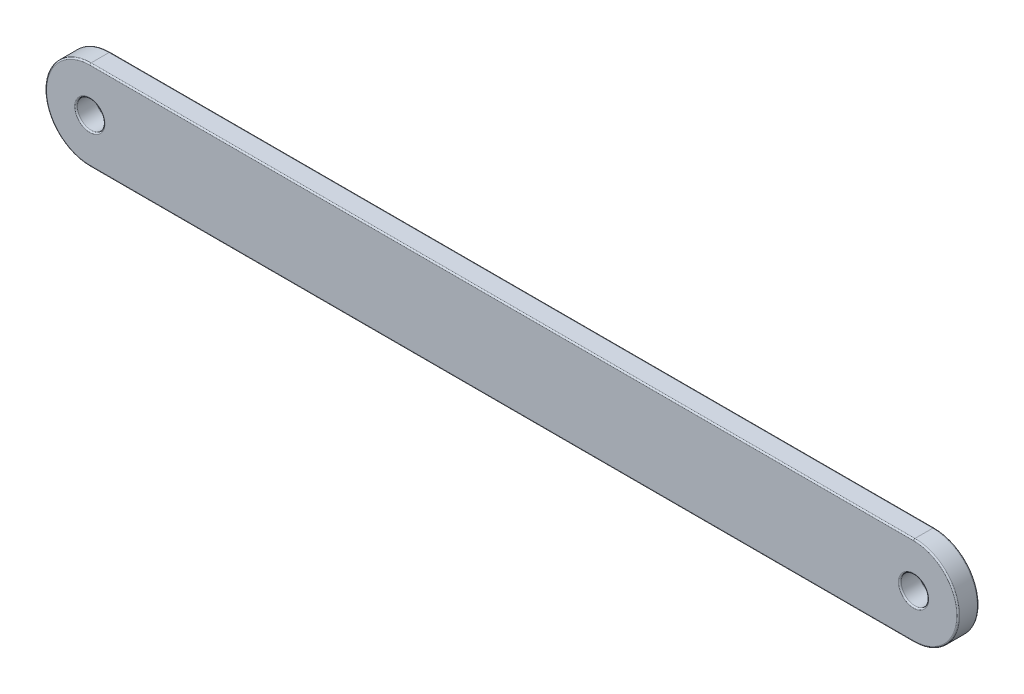
ISO-10303-21;
HEADER;
FILE_DESCRIPTION(('STEP AP214'),'2;1');
FILE_NAME('part.step','',(''),(''),'','','');
FILE_SCHEMA(('AUTOMOTIVE_DESIGN { 1 0 10303 214 1 1 1 1 }'));
ENDSEC;
DATA;
#1=APPLICATION_CONTEXT('core data for automotive mechanical design processes');
#2=APPLICATION_PROTOCOL_DEFINITION('international standard','automotive_design',2000,#1);
#3=PRODUCT_CONTEXT('',#1,'mechanical');
#4=PRODUCT('Part','Part','',(#3));
#5=PRODUCT_RELATED_PRODUCT_CATEGORY('part','',(#4));
#6=PRODUCT_DEFINITION_FORMATION('','',#4);
#7=PRODUCT_DEFINITION_CONTEXT('part definition',#1,'design');
#8=PRODUCT_DEFINITION('design','',#6,#7);
#9=PRODUCT_DEFINITION_SHAPE('','',#8);
#10=(LENGTH_UNIT() NAMED_UNIT(*) SI_UNIT(.MILLI.,.METRE.));
#11=(NAMED_UNIT(*) PLANE_ANGLE_UNIT() SI_UNIT($,.RADIAN.));
#12=(NAMED_UNIT(*) SI_UNIT($,.STERADIAN.) SOLID_ANGLE_UNIT());
#13=UNCERTAINTY_MEASURE_WITH_UNIT(LENGTH_MEASURE(1.E-05),#10,'distance_accuracy_value','');
#14=(GEOMETRIC_REPRESENTATION_CONTEXT(3) GLOBAL_UNCERTAINTY_ASSIGNED_CONTEXT((#13)) GLOBAL_UNIT_ASSIGNED_CONTEXT((#10,
#11,#12)) REPRESENTATION_CONTEXT('',''));
#15=CARTESIAN_POINT('',(0.,0.,0.));
#16=DIRECTION('',(0.,0.,1.));
#17=DIRECTION('',(1.,0.,0.));
#18=AXIS2_PLACEMENT_3D('',#15,#16,#17);
#19=CARTESIAN_POINT('',(-30.,0.,1.5));
#20=DIRECTION('',(0.,0.,1.));
#21=DIRECTION('',(1.,0.,0.));
#22=AXIS2_PLACEMENT_3D('',#19,#20,#21);
#23=PLANE('',#22);
#24=CARTESIAN_POINT('',(30.,0.,1.5));
#25=DIRECTION('',(0.,0.,1.));
#26=DIRECTION('',(1.,0.,0.));
#27=AXIS2_PLACEMENT_3D('',#24,#25,#26);
#28=CIRCLE('',#27,1.1);
#29=CARTESIAN_POINT('',(31.1,0.,1.5));
#30=VERTEX_POINT('',#29);
#31=EDGE_CURVE('E159',#30,#30,#28,.F.);
#32=ORIENTED_EDGE('',*,*,#31,.T.);
#33=EDGE_LOOP('',(#32));
#34=FACE_BOUND('',#33,.T.);
#35=CARTESIAN_POINT('',(-30.,0.,1.5));
#36=DIRECTION('',(0.,0.,1.));
#37=DIRECTION('',(1.,0.,0.));
#38=AXIS2_PLACEMENT_3D('',#35,#36,#37);
#39=CIRCLE('',#38,1.1);
#40=CARTESIAN_POINT('',(-28.9,0.,1.5));
#41=VERTEX_POINT('',#40);
#42=EDGE_CURVE('E156',#41,#41,#39,.F.);
#43=ORIENTED_EDGE('',*,*,#42,.T.);
#44=EDGE_LOOP('',(#43));
#45=FACE_BOUND('',#44,.T.);
#46=DIRECTION('',(-1.,0.,0.));
#47=VECTOR('',#46,1.);
#48=CARTESIAN_POINT('',(-30.,3.15,1.5));
#49=LINE('',#48,#47);
#50=CARTESIAN_POINT('',(30.,3.15000000000001,1.5));
#51=VERTEX_POINT('',#50);
#52=CARTESIAN_POINT('',(-30.,3.15,1.5));
#53=VERTEX_POINT('',#52);
#54=EDGE_CURVE('E147',#51,#53,#49,.T.);
#55=ORIENTED_EDGE('',*,*,#54,.T.);
#56=CARTESIAN_POINT('',(-30.,0.,1.5));
#57=DIRECTION('',(0.,0.,1.));
#58=DIRECTION('',(1.,0.,0.));
#59=AXIS2_PLACEMENT_3D('',#56,#57,#58);
#60=CIRCLE('',#59,3.15);
#61=CARTESIAN_POINT('',(-30.,-3.15,1.5));
#62=VERTEX_POINT('',#61);
#63=EDGE_CURVE('E153',#53,#62,#60,.T.);
#64=ORIENTED_EDGE('',*,*,#63,.T.);
#65=DIRECTION('',(1.,0.,0.));
#66=VECTOR('',#65,1.);
#67=CARTESIAN_POINT('',(30.,-3.14999999999999,1.5));
#68=LINE('',#67,#66);
#69=CARTESIAN_POINT('',(30.,-3.14999999999999,1.5));
#70=VERTEX_POINT('',#69);
#71=EDGE_CURVE('E151',#62,#70,#68,.T.);
#72=ORIENTED_EDGE('',*,*,#71,.T.);
#73=CARTESIAN_POINT('',(30.,0.,1.5));
#74=DIRECTION('',(0.,0.,1.));
#75=DIRECTION('',(1.,0.,0.));
#76=AXIS2_PLACEMENT_3D('',#73,#74,#75);
#77=CIRCLE('',#76,3.15);
#78=EDGE_CURVE('E149',#70,#51,#77,.T.);
#79=ORIENTED_EDGE('',*,*,#78,.T.);
#80=EDGE_LOOP('',(#55,#64,#72,#79));
#81=FACE_BOUND('',#80,.T.);
#82=ADVANCED_FACE('F37',(#34,#45,#81),#23,.T.);
#83=CARTESIAN_POINT('',(-30.,0.,0.));
#84=DIRECTION('',(0.,0.,1.));
#85=DIRECTION('',(1.,0.,0.));
#86=AXIS2_PLACEMENT_3D('',#83,#84,#85);
#87=PLANE('',#86);
#88=CARTESIAN_POINT('',(30.,0.,0.));
#89=DIRECTION('',(0.,0.,1.));
#90=DIRECTION('',(1.,0.,0.));
#91=AXIS2_PLACEMENT_3D('',#88,#89,#90);
#92=CIRCLE('',#91,1.1);
#93=CARTESIAN_POINT('',(31.1,0.,0.));
#94=VERTEX_POINT('',#93);
#95=EDGE_CURVE('E134',#94,#94,#92,.T.);
#96=ORIENTED_EDGE('',*,*,#95,.T.);
#97=EDGE_LOOP('',(#96));
#98=FACE_BOUND('',#97,.T.);
#99=CARTESIAN_POINT('',(-30.,0.,0.));
#100=DIRECTION('',(0.,0.,1.));
#101=DIRECTION('',(1.,0.,0.));
#102=AXIS2_PLACEMENT_3D('',#99,#100,#101);
#103=CIRCLE('',#102,1.1);
#104=CARTESIAN_POINT('',(-28.9,0.,0.));
#105=VERTEX_POINT('',#104);
#106=EDGE_CURVE('E131',#105,#105,#103,.T.);
#107=ORIENTED_EDGE('',*,*,#106,.T.);
#108=EDGE_LOOP('',(#107));
#109=FACE_BOUND('',#108,.T.);
#110=DIRECTION('',(1.,0.,0.));
#111=VECTOR('',#110,1.);
#112=CARTESIAN_POINT('',(-30.,-3.15,0.));
#113=LINE('',#112,#111);
#114=CARTESIAN_POINT('',(30.,-3.14999999999999,0.));
#115=VERTEX_POINT('',#114);
#116=CARTESIAN_POINT('',(-30.,-3.15,0.));
#117=VERTEX_POINT('',#116);
#118=EDGE_CURVE('E130',#115,#117,#113,.F.);
#119=ORIENTED_EDGE('',*,*,#118,.T.);
#120=CARTESIAN_POINT('',(-30.,0.,0.));
#121=DIRECTION('',(0.,0.,1.));
#122=DIRECTION('',(1.,0.,0.));
#123=AXIS2_PLACEMENT_3D('',#120,#121,#122);
#124=CIRCLE('',#123,3.15);
#125=CARTESIAN_POINT('',(-30.,3.15,0.));
#126=VERTEX_POINT('',#125);
#127=EDGE_CURVE('E109',#117,#126,#124,.F.);
#128=ORIENTED_EDGE('',*,*,#127,.T.);
#129=DIRECTION('',(-1.,0.,0.));
#130=VECTOR('',#129,1.);
#131=CARTESIAN_POINT('',(-30.,3.15,0.));
#132=LINE('',#131,#130);
#133=CARTESIAN_POINT('',(30.,3.15000000000001,0.));
#134=VERTEX_POINT('',#133);
#135=EDGE_CURVE('E119',#126,#134,#132,.F.);
#136=ORIENTED_EDGE('',*,*,#135,.T.);
#137=CARTESIAN_POINT('',(30.,0.,0.));
#138=DIRECTION('',(0.,0.,1.));
#139=DIRECTION('',(1.,0.,0.));
#140=AXIS2_PLACEMENT_3D('',#137,#138,#139);
#141=CIRCLE('',#140,3.15);
#142=EDGE_CURVE('E125',#134,#115,#141,.F.);
#143=ORIENTED_EDGE('',*,*,#142,.T.);
#144=EDGE_LOOP('',(#119,#128,#136,#143));
#145=FACE_BOUND('',#144,.T.);
#146=ADVANCED_FACE('F128',(#98,#109,#145),#87,.F.);
#147=CARTESIAN_POINT('',(-30.,0.,1.5));
#148=DIRECTION('',(0.,0.,-1.));
#149=DIRECTION('',(-1.,0.,0.));
#150=AXIS2_PLACEMENT_3D('',#147,#148,#149);
#151=CYLINDRICAL_SURFACE('',#150,3.25);
#152=DIRECTION('',(0.,0.,-1.));
#153=VECTOR('',#152,1.);
#154=CARTESIAN_POINT('',(-30.,3.25,1.5));
#155=LINE('',#154,#153);
#156=CARTESIAN_POINT('',(-30.,3.25,1.4));
#157=VERTEX_POINT('',#156);
#158=CARTESIAN_POINT('',(-30.,3.25,0.1));
#159=VERTEX_POINT('',#158);
#160=EDGE_CURVE('E184',#157,#159,#155,.T.);
#161=ORIENTED_EDGE('',*,*,#160,.T.);
#162=CARTESIAN_POINT('',(-30.,0.,0.1));
#163=DIRECTION('',(0.,0.,1.));
#164=DIRECTION('',(1.,0.,0.));
#165=AXIS2_PLACEMENT_3D('',#162,#163,#164);
#166=CIRCLE('',#165,3.25);
#167=CARTESIAN_POINT('',(-30.,-3.25,0.1));
#168=VERTEX_POINT('',#167);
#169=EDGE_CURVE('E112',#159,#168,#166,.T.);
#170=ORIENTED_EDGE('',*,*,#169,.T.);
#171=DIRECTION('',(0.,0.,-1.));
#172=VECTOR('',#171,1.);
#173=CARTESIAN_POINT('',(-30.,-3.25,1.5));
#174=LINE('',#173,#172);
#175=CARTESIAN_POINT('',(-30.,-3.25,1.4));
#176=VERTEX_POINT('',#175);
#177=EDGE_CURVE('E126',#176,#168,#174,.T.);
#178=ORIENTED_EDGE('',*,*,#177,.F.);
#179=CARTESIAN_POINT('',(-30.,0.,1.4));
#180=DIRECTION('',(0.,0.,1.));
#181=DIRECTION('',(1.,0.,0.));
#182=AXIS2_PLACEMENT_3D('',#179,#180,#181);
#183=CIRCLE('',#182,3.25);
#184=EDGE_CURVE('E168',#176,#157,#183,.F.);
#185=ORIENTED_EDGE('',*,*,#184,.T.);
#186=EDGE_LOOP('',(#161,#170,#178,#185));
#187=FACE_BOUND('',#186,.T.);
#188=ADVANCED_FACE('F223',(#187),#151,.T.);
#189=CARTESIAN_POINT('',(-30.,-3.25,1.5));
#190=DIRECTION('',(0.,1.,0.));
#191=DIRECTION('',(-1.,0.,0.));
#192=AXIS2_PLACEMENT_3D('',#189,#190,#191);
#193=PLANE('',#192);
#194=ORIENTED_EDGE('',*,*,#177,.T.);
#195=DIRECTION('',(1.,0.,0.));
#196=VECTOR('',#195,1.);
#197=CARTESIAN_POINT('',(-30.,-3.25,0.1));
#198=LINE('',#197,#196);
#199=CARTESIAN_POINT('',(30.,-3.24999999999999,0.1));
#200=VERTEX_POINT('',#199);
#201=EDGE_CURVE('E174',#168,#200,#198,.T.);
#202=ORIENTED_EDGE('',*,*,#201,.T.);
#203=DIRECTION('',(0.,0.,-1.));
#204=VECTOR('',#203,1.);
#205=CARTESIAN_POINT('',(30.,-3.24999999999999,1.5));
#206=LINE('',#205,#204);
#207=CARTESIAN_POINT('',(30.,-3.24999999999999,1.4));
#208=VERTEX_POINT('',#207);
#209=EDGE_CURVE('E205',#208,#200,#206,.T.);
#210=ORIENTED_EDGE('',*,*,#209,.F.);
#211=DIRECTION('',(1.,0.,0.));
#212=VECTOR('',#211,1.);
#213=CARTESIAN_POINT('',(-30.,-3.25,1.4));
#214=LINE('',#213,#212);
#215=EDGE_CURVE('E172',#208,#176,#214,.F.);
#216=ORIENTED_EDGE('',*,*,#215,.T.);
#217=EDGE_LOOP('',(#194,#202,#210,#216));
#218=FACE_BOUND('',#217,.T.);
#219=ADVANCED_FACE('F209',(#218),#193,.F.);
#220=CARTESIAN_POINT('',(30.,0.,1.5));
#221=DIRECTION('',(0.,0.,-1.));
#222=DIRECTION('',(-1.,0.,0.));
#223=AXIS2_PLACEMENT_3D('',#220,#221,#222);
#224=CYLINDRICAL_SURFACE('',#223,3.25);
#225=ORIENTED_EDGE('',*,*,#209,.T.);
#226=CARTESIAN_POINT('',(30.,0.,0.1));
#227=DIRECTION('',(0.,0.,1.));
#228=DIRECTION('',(1.,0.,0.));
#229=AXIS2_PLACEMENT_3D('',#226,#227,#228);
#230=CIRCLE('',#229,3.25);
#231=CARTESIAN_POINT('',(30.,3.25000000000001,0.1));
#232=VERTEX_POINT('',#231);
#233=EDGE_CURVE('E54',#200,#232,#230,.T.);
#234=ORIENTED_EDGE('',*,*,#233,.T.);
#235=DIRECTION('',(0.,0.,-1.));
#236=VECTOR('',#235,1.);
#237=CARTESIAN_POINT('',(30.,3.25000000000001,1.5));
#238=LINE('',#237,#236);
#239=CARTESIAN_POINT('',(30.,3.25000000000001,1.4));
#240=VERTEX_POINT('',#239);
#241=EDGE_CURVE('E206',#240,#232,#238,.T.);
#242=ORIENTED_EDGE('',*,*,#241,.F.);
#243=CARTESIAN_POINT('',(30.,0.,1.4));
#244=DIRECTION('',(0.,0.,1.));
#245=DIRECTION('',(1.,0.,0.));
#246=AXIS2_PLACEMENT_3D('',#243,#244,#245);
#247=CIRCLE('',#246,3.25);
#248=EDGE_CURVE('E176',#240,#208,#247,.F.);
#249=ORIENTED_EDGE('',*,*,#248,.T.);
#250=EDGE_LOOP('',(#225,#234,#242,#249));
#251=FACE_BOUND('',#250,.T.);
#252=ADVANCED_FACE('F204',(#251),#224,.T.);
#253=CARTESIAN_POINT('',(-30.,3.25,1.5));
#254=DIRECTION('',(0.,-1.,0.));
#255=DIRECTION('',(1.,0.,0.));
#256=AXIS2_PLACEMENT_3D('',#253,#254,#255);
#257=PLANE('',#256);
#258=ORIENTED_EDGE('',*,*,#241,.T.);
#259=DIRECTION('',(-1.,0.,0.));
#260=VECTOR('',#259,1.);
#261=CARTESIAN_POINT('',(-30.,3.25,0.1));
#262=LINE('',#261,#260);
#263=EDGE_CURVE('E11',#232,#159,#262,.T.);
#264=ORIENTED_EDGE('',*,*,#263,.T.);
#265=ORIENTED_EDGE('',*,*,#160,.F.);
#266=DIRECTION('',(-1.,0.,0.));
#267=VECTOR('',#266,1.);
#268=CARTESIAN_POINT('',(30.,3.25000000000001,1.4));
#269=LINE('',#268,#267);
#270=EDGE_CURVE('E46',#157,#240,#269,.F.);
#271=ORIENTED_EDGE('',*,*,#270,.T.);
#272=EDGE_LOOP('',(#258,#264,#265,#271));
#273=FACE_BOUND('',#272,.T.);
#274=ADVANCED_FACE('F225',(#273),#257,.F.);
#275=CARTESIAN_POINT('',(-30.,0.,1.5));
#276=DIRECTION('',(0.,0.,-1.));
#277=DIRECTION('',(-1.,0.,0.));
#278=AXIS2_PLACEMENT_3D('',#275,#276,#277);
#279=CYLINDRICAL_SURFACE('',#278,1.);
#280=CARTESIAN_POINT('',(-30.,0.,0.1));
#281=DIRECTION('',(0.,0.,1.));
#282=DIRECTION('',(1.,0.,0.));
#283=AXIS2_PLACEMENT_3D('',#280,#281,#282);
#284=CIRCLE('',#283,1.);
#285=CARTESIAN_POINT('',(-29.,0.,0.1));
#286=VERTEX_POINT('',#285);
#287=EDGE_CURVE('E165',#286,#286,#284,.F.);
#288=ORIENTED_EDGE('',*,*,#287,.T.);
#289=EDGE_LOOP('',(#288));
#290=FACE_BOUND('',#289,.T.);
#291=CARTESIAN_POINT('',(-30.,0.,1.4));
#292=DIRECTION('',(0.,0.,1.));
#293=DIRECTION('',(1.,0.,0.));
#294=AXIS2_PLACEMENT_3D('',#291,#292,#293);
#295=CIRCLE('',#294,1.);
#296=CARTESIAN_POINT('',(-29.,0.,1.4));
#297=VERTEX_POINT('',#296);
#298=EDGE_CURVE('E162',#297,#297,#295,.T.);
#299=ORIENTED_EDGE('',*,*,#298,.T.);
#300=EDGE_LOOP('',(#299));
#301=FACE_BOUND('',#300,.T.);
#302=ADVANCED_FACE('F227',(#290,#301),#279,.F.);
#303=CARTESIAN_POINT('',(30.,0.,1.5));
#304=DIRECTION('',(0.,0.,-1.));
#305=DIRECTION('',(-1.,0.,0.));
#306=AXIS2_PLACEMENT_3D('',#303,#304,#305);
#307=CYLINDRICAL_SURFACE('',#306,1.);
#308=CARTESIAN_POINT('',(30.,0.,0.1));
#309=DIRECTION('',(0.,0.,1.));
#310=DIRECTION('',(1.,0.,0.));
#311=AXIS2_PLACEMENT_3D('',#308,#309,#310);
#312=CIRCLE('',#311,1.);
#313=CARTESIAN_POINT('',(31.,0.,0.1));
#314=VERTEX_POINT('',#313);
#315=EDGE_CURVE('E144',#314,#314,#312,.F.);
#316=ORIENTED_EDGE('',*,*,#315,.T.);
#317=EDGE_LOOP('',(#316));
#318=FACE_BOUND('',#317,.T.);
#319=CARTESIAN_POINT('',(30.,0.,1.4));
#320=DIRECTION('',(0.,0.,1.));
#321=DIRECTION('',(1.,0.,0.));
#322=AXIS2_PLACEMENT_3D('',#319,#320,#321);
#323=CIRCLE('',#322,1.);
#324=CARTESIAN_POINT('',(31.,0.,1.4));
#325=VERTEX_POINT('',#324);
#326=EDGE_CURVE('E141',#325,#325,#323,.T.);
#327=ORIENTED_EDGE('',*,*,#326,.T.);
#328=EDGE_LOOP('',(#327));
#329=FACE_BOUND('',#328,.T.);
#330=ADVANCED_FACE('F233',(#318,#329),#307,.F.);
#331=CARTESIAN_POINT('',(30.,0.,0.1));
#332=DIRECTION('',(0.,0.,1.));
#333=DIRECTION('',(1.,0.,0.));
#334=AXIS2_PLACEMENT_3D('',#331,#332,#333);
#335=TOROIDAL_SURFACE('',#334,1.1,0.1);
#336=ORIENTED_EDGE('',*,*,#315,.F.);
#337=EDGE_LOOP('',(#336));
#338=FACE_BOUND('',#337,.T.);
#339=ORIENTED_EDGE('',*,*,#95,.F.);
#340=EDGE_LOOP('',(#339));
#341=FACE_BOUND('',#340,.T.);
#342=ADVANCED_FACE('F248',(#338,#341),#335,.T.);
#343=CARTESIAN_POINT('',(30.,0.,1.4));
#344=DIRECTION('',(0.,0.,1.));
#345=DIRECTION('',(1.,0.,0.));
#346=AXIS2_PLACEMENT_3D('',#343,#344,#345);
#347=TOROIDAL_SURFACE('',#346,1.1,0.1);
#348=ORIENTED_EDGE('',*,*,#31,.F.);
#349=EDGE_LOOP('',(#348));
#350=FACE_BOUND('',#349,.T.);
#351=ORIENTED_EDGE('',*,*,#326,.F.);
#352=EDGE_LOOP('',(#351));
#353=FACE_BOUND('',#352,.T.);
#354=ADVANCED_FACE('F253',(#350,#353),#347,.T.);
#355=CARTESIAN_POINT('',(-30.,0.,0.1));
#356=DIRECTION('',(0.,0.,1.));
#357=DIRECTION('',(1.,0.,0.));
#358=AXIS2_PLACEMENT_3D('',#355,#356,#357);
#359=TOROIDAL_SURFACE('',#358,1.1,0.1);
#360=ORIENTED_EDGE('',*,*,#287,.F.);
#361=EDGE_LOOP('',(#360));
#362=FACE_BOUND('',#361,.T.);
#363=ORIENTED_EDGE('',*,*,#106,.F.);
#364=EDGE_LOOP('',(#363));
#365=FACE_BOUND('',#364,.T.);
#366=ADVANCED_FACE('F261',(#362,#365),#359,.T.);
#367=CARTESIAN_POINT('',(-30.,0.,1.4));
#368=DIRECTION('',(0.,0.,1.));
#369=DIRECTION('',(1.,0.,0.));
#370=AXIS2_PLACEMENT_3D('',#367,#368,#369);
#371=TOROIDAL_SURFACE('',#370,1.1,0.1);
#372=ORIENTED_EDGE('',*,*,#42,.F.);
#373=EDGE_LOOP('',(#372));
#374=FACE_BOUND('',#373,.T.);
#375=ORIENTED_EDGE('',*,*,#298,.F.);
#376=EDGE_LOOP('',(#375));
#377=FACE_BOUND('',#376,.T.);
#378=ADVANCED_FACE('F267',(#374,#377),#371,.T.);
#379=CARTESIAN_POINT('',(30.,0.,0.1));
#380=DIRECTION('',(0.,0.,1.));
#381=DIRECTION('',(1.,0.,0.));
#382=AXIS2_PLACEMENT_3D('',#379,#380,#381);
#383=TOROIDAL_SURFACE('',#382,3.15,0.1);
#384=CARTESIAN_POINT('',(30.,-3.14999999999999,0.1));
#385=DIRECTION('',(-1.,0.,0.));
#386=DIRECTION('',(0.,0.,1.));
#387=AXIS2_PLACEMENT_3D('',#384,#385,#386);
#388=CIRCLE('',#387,0.1);
#389=EDGE_CURVE('E115',#115,#200,#388,.T.);
#390=ORIENTED_EDGE('',*,*,#389,.F.);
#391=ORIENTED_EDGE('',*,*,#142,.F.);
#392=CARTESIAN_POINT('',(30.,3.15000000000001,0.1));
#393=DIRECTION('',(-1.,0.,0.));
#394=DIRECTION('',(0.,0.,1.));
#395=AXIS2_PLACEMENT_3D('',#392,#393,#394);
#396=CIRCLE('',#395,0.1);
#397=EDGE_CURVE('E122',#232,#134,#396,.T.);
#398=ORIENTED_EDGE('',*,*,#397,.F.);
#399=ORIENTED_EDGE('',*,*,#233,.F.);
#400=EDGE_LOOP('',(#390,#391,#398,#399));
#401=FACE_BOUND('',#400,.T.);
#402=ADVANCED_FACE('F218',(#401),#383,.T.);
#403=CARTESIAN_POINT('',(-30.,3.15,0.1));
#404=DIRECTION('',(-1.,0.,0.));
#405=DIRECTION('',(0.,-1.,0.));
#406=AXIS2_PLACEMENT_3D('',#403,#404,#405);
#407=CYLINDRICAL_SURFACE('',#406,0.1);
#408=ORIENTED_EDGE('',*,*,#397,.T.);
#409=ORIENTED_EDGE('',*,*,#135,.F.);
#410=CARTESIAN_POINT('',(-30.,3.15,0.1));
#411=DIRECTION('',(-1.,0.,0.));
#412=DIRECTION('',(0.,0.,1.));
#413=AXIS2_PLACEMENT_3D('',#410,#411,#412);
#414=CIRCLE('',#413,0.1);
#415=EDGE_CURVE('E105',#159,#126,#414,.T.);
#416=ORIENTED_EDGE('',*,*,#415,.F.);
#417=ORIENTED_EDGE('',*,*,#263,.F.);
#418=EDGE_LOOP('',(#408,#409,#416,#417));
#419=FACE_BOUND('',#418,.T.);
#420=ADVANCED_FACE('F120',(#419),#407,.T.);
#421=CARTESIAN_POINT('',(-30.,-3.15,0.1));
#422=DIRECTION('',(1.,0.,0.));
#423=DIRECTION('',(0.,1.,0.));
#424=AXIS2_PLACEMENT_3D('',#421,#422,#423);
#425=CYLINDRICAL_SURFACE('',#424,0.1);
#426=ORIENTED_EDGE('',*,*,#389,.T.);
#427=ORIENTED_EDGE('',*,*,#201,.F.);
#428=CARTESIAN_POINT('',(-30.,-3.15,0.1));
#429=DIRECTION('',(-1.,0.,0.));
#430=DIRECTION('',(0.,0.,1.));
#431=AXIS2_PLACEMENT_3D('',#428,#429,#430);
#432=CIRCLE('',#431,0.1);
#433=EDGE_CURVE('E116',#117,#168,#432,.T.);
#434=ORIENTED_EDGE('',*,*,#433,.F.);
#435=ORIENTED_EDGE('',*,*,#118,.F.);
#436=EDGE_LOOP('',(#426,#427,#434,#435));
#437=FACE_BOUND('',#436,.T.);
#438=ADVANCED_FACE('F220',(#437),#425,.T.);
#439=CARTESIAN_POINT('',(-30.,0.,0.1));
#440=DIRECTION('',(0.,0.,1.));
#441=DIRECTION('',(1.,0.,0.));
#442=AXIS2_PLACEMENT_3D('',#439,#440,#441);
#443=TOROIDAL_SURFACE('',#442,3.15,0.1);
#444=ORIENTED_EDGE('',*,*,#415,.T.);
#445=ORIENTED_EDGE('',*,*,#127,.F.);
#446=ORIENTED_EDGE('',*,*,#433,.T.);
#447=ORIENTED_EDGE('',*,*,#169,.F.);
#448=EDGE_LOOP('',(#444,#445,#446,#447));
#449=FACE_BOUND('',#448,.T.);
#450=ADVANCED_FACE('F107',(#449),#443,.T.);
#451=CARTESIAN_POINT('',(30.,0.,1.4));
#452=DIRECTION('',(0.,0.,1.));
#453=DIRECTION('',(1.,0.,0.));
#454=AXIS2_PLACEMENT_3D('',#451,#452,#453);
#455=TOROIDAL_SURFACE('',#454,3.15,0.1);
#456=CARTESIAN_POINT('',(30.,-3.14999999999999,1.4));
#457=DIRECTION('',(-1.,0.,0.));
#458=DIRECTION('',(0.,0.,1.));
#459=AXIS2_PLACEMENT_3D('',#456,#457,#458);
#460=CIRCLE('',#459,0.1);
#461=EDGE_CURVE('E188',#208,#70,#460,.T.);
#462=ORIENTED_EDGE('',*,*,#461,.F.);
#463=ORIENTED_EDGE('',*,*,#248,.F.);
#464=CARTESIAN_POINT('',(30.,3.15000000000001,1.4));
#465=DIRECTION('',(-1.,0.,0.));
#466=DIRECTION('',(0.,0.,1.));
#467=AXIS2_PLACEMENT_3D('',#464,#465,#466);
#468=CIRCLE('',#467,0.1);
#469=EDGE_CURVE('E41',#51,#240,#468,.T.);
#470=ORIENTED_EDGE('',*,*,#469,.F.);
#471=ORIENTED_EDGE('',*,*,#78,.F.);
#472=EDGE_LOOP('',(#462,#463,#470,#471));
#473=FACE_BOUND('',#472,.T.);
#474=ADVANCED_FACE('F39',(#473),#455,.T.);
#475=CARTESIAN_POINT('',(-30.,3.15,1.4));
#476=DIRECTION('',(1.,0.,0.));
#477=DIRECTION('',(0.,1.,0.));
#478=AXIS2_PLACEMENT_3D('',#475,#476,#477);
#479=CYLINDRICAL_SURFACE('',#478,0.1);
#480=ORIENTED_EDGE('',*,*,#469,.T.);
#481=ORIENTED_EDGE('',*,*,#270,.F.);
#482=CARTESIAN_POINT('',(-30.,3.15,1.4));
#483=DIRECTION('',(-1.,0.,0.));
#484=DIRECTION('',(0.,0.,1.));
#485=AXIS2_PLACEMENT_3D('',#482,#483,#484);
#486=CIRCLE('',#485,0.1);
#487=EDGE_CURVE('E187',#53,#157,#486,.T.);
#488=ORIENTED_EDGE('',*,*,#487,.F.);
#489=ORIENTED_EDGE('',*,*,#54,.F.);
#490=EDGE_LOOP('',(#480,#481,#488,#489));
#491=FACE_BOUND('',#490,.T.);
#492=ADVANCED_FACE('F198',(#491),#479,.T.);
#493=CARTESIAN_POINT('',(-30.,-3.15,1.4));
#494=DIRECTION('',(-1.,0.,0.));
#495=DIRECTION('',(0.,-1.,0.));
#496=AXIS2_PLACEMENT_3D('',#493,#494,#495);
#497=CYLINDRICAL_SURFACE('',#496,0.1);
#498=ORIENTED_EDGE('',*,*,#461,.T.);
#499=ORIENTED_EDGE('',*,*,#71,.F.);
#500=CARTESIAN_POINT('',(-30.,-3.15,1.4));
#501=DIRECTION('',(-1.,0.,0.));
#502=DIRECTION('',(0.,0.,1.));
#503=AXIS2_PLACEMENT_3D('',#500,#501,#502);
#504=CIRCLE('',#503,0.1);
#505=EDGE_CURVE('E185',#176,#62,#504,.T.);
#506=ORIENTED_EDGE('',*,*,#505,.F.);
#507=ORIENTED_EDGE('',*,*,#215,.F.);
#508=EDGE_LOOP('',(#498,#499,#506,#507));
#509=FACE_BOUND('',#508,.T.);
#510=ADVANCED_FACE('F287',(#509),#497,.T.);
#511=CARTESIAN_POINT('',(-30.,0.,1.4));
#512=DIRECTION('',(0.,0.,1.));
#513=DIRECTION('',(1.,0.,0.));
#514=AXIS2_PLACEMENT_3D('',#511,#512,#513);
#515=TOROIDAL_SURFACE('',#514,3.15,0.1);
#516=ORIENTED_EDGE('',*,*,#487,.T.);
#517=ORIENTED_EDGE('',*,*,#184,.F.);
#518=ORIENTED_EDGE('',*,*,#505,.T.);
#519=ORIENTED_EDGE('',*,*,#63,.F.);
#520=EDGE_LOOP('',(#516,#517,#518,#519));
#521=FACE_BOUND('',#520,.T.);
#522=ADVANCED_FACE('F284',(#521),#515,.T.);
#523=CLOSED_SHELL('',(#82,#146,#188,#219,#252,#274,#302,#330,#342,#354,#366,#378,#402,#420,#438,
#450,#474,#492,#510,#522));
#524=MANIFOLD_SOLID_BREP('B2',#523);
#525=ADVANCED_BREP_SHAPE_REPRESENTATION('',(#18,#524),#14);
#526=SHAPE_DEFINITION_REPRESENTATION(#9,#525);
ENDSEC;
END-ISO-10303-21;
